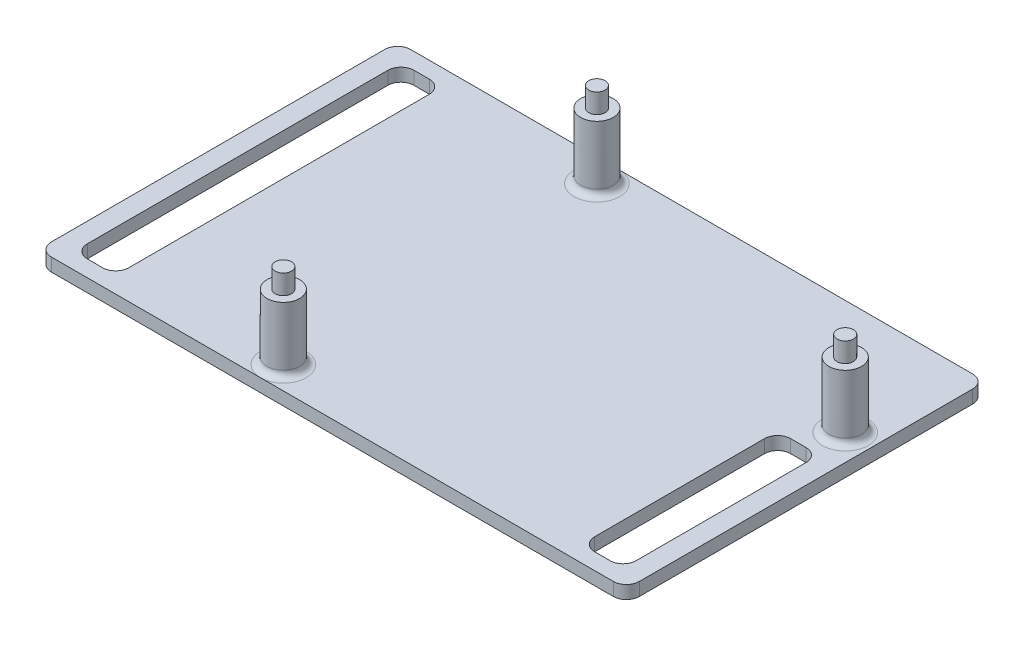
ISO-10303-21;
HEADER;
FILE_DESCRIPTION(('STEP AP214'),'2;1');
FILE_NAME('part.step','',(''),(''),'','','');
FILE_SCHEMA(('AUTOMOTIVE_DESIGN { 1 0 10303 214 1 1 1 1 }'));
ENDSEC;
DATA;
#1=APPLICATION_CONTEXT('core data for automotive mechanical design processes');
#2=APPLICATION_PROTOCOL_DEFINITION('international standard','automotive_design',2000,#1);
#3=PRODUCT_CONTEXT('',#1,'mechanical');
#4=PRODUCT('Part','Part','',(#3));
#5=PRODUCT_RELATED_PRODUCT_CATEGORY('part','',(#4));
#6=PRODUCT_DEFINITION_FORMATION('','',#4);
#7=PRODUCT_DEFINITION_CONTEXT('part definition',#1,'design');
#8=PRODUCT_DEFINITION('design','',#6,#7);
#9=PRODUCT_DEFINITION_SHAPE('','',#8);
#10=(LENGTH_UNIT() NAMED_UNIT(*) SI_UNIT(.MILLI.,.METRE.));
#11=(NAMED_UNIT(*) PLANE_ANGLE_UNIT() SI_UNIT($,.RADIAN.));
#12=(NAMED_UNIT(*) SI_UNIT($,.STERADIAN.) SOLID_ANGLE_UNIT());
#13=UNCERTAINTY_MEASURE_WITH_UNIT(LENGTH_MEASURE(1.E-05),#10,'distance_accuracy_value','');
#14=(GEOMETRIC_REPRESENTATION_CONTEXT(3) GLOBAL_UNCERTAINTY_ASSIGNED_CONTEXT((#13)) GLOBAL_UNIT_ASSIGNED_CONTEXT((#10,
#11,#12)) REPRESENTATION_CONTEXT('',''));
#15=CARTESIAN_POINT('',(0.,0.,0.));
#16=DIRECTION('',(0.,0.,1.));
#17=DIRECTION('',(1.,0.,0.));
#18=AXIS2_PLACEMENT_3D('',#15,#16,#17);
#19=CARTESIAN_POINT('',(0.,2.,0.));
#20=DIRECTION('',(0.,-1.,0.));
#21=DIRECTION('',(0.,0.,-1.));
#22=AXIS2_PLACEMENT_3D('',#19,#20,#21);
#23=PLANE('',#22);
#24=CARTESIAN_POINT('',(86.,2.,-37.5));
#25=DIRECTION('',(0.,-1.,0.));
#26=DIRECTION('',(0.,0.,-1.));
#27=AXIS2_PLACEMENT_3D('',#24,#25,#26);
#28=CIRCLE('',#27,3.50000000000001);
#29=CARTESIAN_POINT('',(86.,2.,-41.));
#30=VERTEX_POINT('',#29);
#31=EDGE_CURVE('E344',#30,#30,#28,.T.);
#32=ORIENTED_EDGE('',*,*,#31,.T.);
#33=EDGE_LOOP('',(#32));
#34=FACE_BOUND('',#33,.T.);
#35=DIRECTION('',(0.,0.,1.));
#36=VECTOR('',#35,1.);
#37=CARTESIAN_POINT('',(80.65,2.,-32.5));
#38=LINE('',#37,#36);
#39=CARTESIAN_POINT('',(80.65,2.,-30.5));
#40=VERTEX_POINT('',#39);
#41=CARTESIAN_POINT('',(80.65,2.,-4.49999999999999));
#42=VERTEX_POINT('',#41);
#43=EDGE_CURVE('E500',#40,#42,#38,.T.);
#44=ORIENTED_EDGE('',*,*,#43,.F.);
#45=CARTESIAN_POINT('',(82.65,2.,-30.5));
#46=DIRECTION('',(0.,-1.,0.));
#47=DIRECTION('',(0.,0.,-1.));
#48=AXIS2_PLACEMENT_3D('',#45,#46,#47);
#49=CIRCLE('',#48,2.);
#50=CARTESIAN_POINT('',(82.65,2.,-32.5));
#51=VERTEX_POINT('',#50);
#52=EDGE_CURVE('E337',#40,#51,#49,.T.);
#53=ORIENTED_EDGE('',*,*,#52,.T.);
#54=DIRECTION('',(-1.,0.,0.));
#55=VECTOR('',#54,1.);
#56=CARTESIAN_POINT('',(80.65,2.,-32.5));
#57=LINE('',#56,#55);
#58=CARTESIAN_POINT('',(85.,2.,-32.5));
#59=VERTEX_POINT('',#58);
#60=EDGE_CURVE('E473',#59,#51,#57,.T.);
#61=ORIENTED_EDGE('',*,*,#60,.F.);
#62=CARTESIAN_POINT('',(85.,2.,-30.5));
#63=DIRECTION('',(0.,-1.,0.));
#64=DIRECTION('',(0.,0.,-1.));
#65=AXIS2_PLACEMENT_3D('',#62,#63,#64);
#66=CIRCLE('',#65,2.);
#67=CARTESIAN_POINT('',(87.,2.,-30.5));
#68=VERTEX_POINT('',#67);
#69=EDGE_CURVE('E333',#59,#68,#66,.T.);
#70=ORIENTED_EDGE('',*,*,#69,.T.);
#71=DIRECTION('',(0.,0.,-1.));
#72=VECTOR('',#71,1.);
#73=CARTESIAN_POINT('',(87.,2.,-32.5));
#74=LINE('',#73,#72);
#75=CARTESIAN_POINT('',(87.,2.,-4.49999999999999));
#76=VERTEX_POINT('',#75);
#77=EDGE_CURVE('E509',#76,#68,#74,.T.);
#78=ORIENTED_EDGE('',*,*,#77,.F.);
#79=CARTESIAN_POINT('',(85.,2.,-4.49999999999999));
#80=DIRECTION('',(0.,-1.,0.));
#81=DIRECTION('',(0.,0.,-1.));
#82=AXIS2_PLACEMENT_3D('',#79,#80,#81);
#83=CIRCLE('',#82,2.);
#84=CARTESIAN_POINT('',(85.,2.,-2.49999999999999));
#85=VERTEX_POINT('',#84);
#86=EDGE_CURVE('E329',#76,#85,#83,.T.);
#87=ORIENTED_EDGE('',*,*,#86,.T.);
#88=DIRECTION('',(1.,0.,0.));
#89=VECTOR('',#88,1.);
#90=CARTESIAN_POINT('',(80.65,2.,-2.49999999999999));
#91=LINE('',#90,#89);
#92=CARTESIAN_POINT('',(82.65,2.,-2.49999999999999));
#93=VERTEX_POINT('',#92);
#94=EDGE_CURVE('E512',#93,#85,#91,.T.);
#95=ORIENTED_EDGE('',*,*,#94,.F.);
#96=CARTESIAN_POINT('',(82.65,2.,-4.49999999999999));
#97=DIRECTION('',(0.,-1.,0.));
#98=DIRECTION('',(0.,0.,-1.));
#99=AXIS2_PLACEMENT_3D('',#96,#97,#98);
#100=CIRCLE('',#99,2.);
#101=EDGE_CURVE('E325',#93,#42,#100,.T.);
#102=ORIENTED_EDGE('',*,*,#101,.T.);
#103=EDGE_LOOP('',(#44,#53,#61,#70,#78,#87,#95,#102));
#104=FACE_BOUND('',#103,.T.);
#105=DIRECTION('',(1.,0.,0.));
#106=VECTOR('',#105,1.);
#107=CARTESIAN_POINT('',(0.,2.,0.));
#108=LINE('',#107,#106);
#109=CARTESIAN_POINT('',(2.,2.,0.));
#110=VERTEX_POINT('',#109);
#111=CARTESIAN_POINT('',(34.,2.,0.));
#112=VERTEX_POINT('',#111);
#113=EDGE_CURVE('E455',#110,#112,#108,.T.);
#114=ORIENTED_EDGE('',*,*,#113,.T.);
#115=CARTESIAN_POINT('',(34.,2.,-3.49999999999999));
#116=DIRECTION('',(0.,-1.,0.));
#117=DIRECTION('',(0.,0.,-1.));
#118=AXIS2_PLACEMENT_3D('',#115,#116,#117);
#119=CIRCLE('',#118,3.49999999999999);
#120=EDGE_CURVE('E52',#112,#112,#119,.T.);
#121=ORIENTED_EDGE('',*,*,#120,.T.);
#122=CARTESIAN_POINT('',(88.,2.,0.));
#123=VERTEX_POINT('',#122);
#124=EDGE_CURVE('E453',#112,#123,#108,.T.);
#125=ORIENTED_EDGE('',*,*,#124,.T.);
#126=CARTESIAN_POINT('',(88.,2.,-2.));
#127=DIRECTION('',(0.,-1.,0.));
#128=DIRECTION('',(0.,0.,-1.));
#129=AXIS2_PLACEMENT_3D('',#126,#127,#128);
#130=CIRCLE('',#129,2.);
#131=CARTESIAN_POINT('',(90.,2.,-2.));
#132=VERTEX_POINT('',#131);
#133=EDGE_CURVE('E296',#123,#132,#130,.F.);
#134=ORIENTED_EDGE('',*,*,#133,.T.);
#135=DIRECTION('',(0.,0.,-1.));
#136=VECTOR('',#135,1.);
#137=CARTESIAN_POINT('',(90.,2.,0.));
#138=LINE('',#137,#136);
#139=CARTESIAN_POINT('',(90.,2.,-53.));
#140=VERTEX_POINT('',#139);
#141=EDGE_CURVE('E463',#132,#140,#138,.T.);
#142=ORIENTED_EDGE('',*,*,#141,.T.);
#143=CARTESIAN_POINT('',(88.,2.,-53.));
#144=DIRECTION('',(0.,-1.,0.));
#145=DIRECTION('',(0.,0.,-1.));
#146=AXIS2_PLACEMENT_3D('',#143,#144,#145);
#147=CIRCLE('',#146,2.);
#148=CARTESIAN_POINT('',(88.,2.,-55.));
#149=VERTEX_POINT('',#148);
#150=EDGE_CURVE('E298',#140,#149,#147,.F.);
#151=ORIENTED_EDGE('',*,*,#150,.T.);
#152=DIRECTION('',(-1.,0.,0.));
#153=VECTOR('',#152,1.);
#154=CARTESIAN_POINT('',(0.,2.,-55.));
#155=LINE('',#154,#153);
#156=CARTESIAN_POINT('',(34.,2.,-55.));
#157=VERTEX_POINT('',#156);
#158=EDGE_CURVE('E466',#149,#157,#155,.T.);
#159=ORIENTED_EDGE('',*,*,#158,.T.);
#160=CARTESIAN_POINT('',(34.,2.,-51.5));
#161=DIRECTION('',(0.,-1.,0.));
#162=DIRECTION('',(0.,0.,-1.));
#163=AXIS2_PLACEMENT_3D('',#160,#161,#162);
#164=CIRCLE('',#163,3.5);
#165=EDGE_CURVE('E57',#157,#157,#164,.T.);
#166=ORIENTED_EDGE('',*,*,#165,.T.);
#167=CARTESIAN_POINT('',(2.,2.,-55.));
#168=VERTEX_POINT('',#167);
#169=EDGE_CURVE('E449',#157,#168,#155,.T.);
#170=ORIENTED_EDGE('',*,*,#169,.T.);
#171=CARTESIAN_POINT('',(2.,2.,-53.));
#172=DIRECTION('',(0.,-1.,0.));
#173=DIRECTION('',(0.,0.,-1.));
#174=AXIS2_PLACEMENT_3D('',#171,#172,#173);
#175=CIRCLE('',#174,2.);
#176=CARTESIAN_POINT('',(0.,2.,-53.));
#177=VERTEX_POINT('',#176);
#178=EDGE_CURVE('E292',#168,#177,#175,.F.);
#179=ORIENTED_EDGE('',*,*,#178,.T.);
#180=DIRECTION('',(0.,0.,1.));
#181=VECTOR('',#180,1.);
#182=CARTESIAN_POINT('',(0.,2.,0.));
#183=LINE('',#182,#181);
#184=CARTESIAN_POINT('',(0.,2.,-2.));
#185=VERTEX_POINT('',#184);
#186=EDGE_CURVE('E446',#177,#185,#183,.T.);
#187=ORIENTED_EDGE('',*,*,#186,.T.);
#188=CARTESIAN_POINT('',(2.,2.,-2.));
#189=DIRECTION('',(0.,-1.,0.));
#190=DIRECTION('',(0.,0.,-1.));
#191=AXIS2_PLACEMENT_3D('',#188,#189,#190);
#192=CIRCLE('',#191,2.);
#193=EDGE_CURVE('E294',#185,#110,#192,.F.);
#194=ORIENTED_EDGE('',*,*,#193,.T.);
#195=EDGE_LOOP('',(#114,#121,#125,#134,#142,#151,#159,#166,#170,#179,#187,#194));
#196=FACE_BOUND('',#195,.T.);
#197=DIRECTION('',(0.,0.,1.));
#198=VECTOR('',#197,1.);
#199=CARTESIAN_POINT('',(3.,2.,-52.5));
#200=LINE('',#199,#198);
#201=CARTESIAN_POINT('',(3.,2.,-50.5));
#202=VERTEX_POINT('',#201);
#203=CARTESIAN_POINT('',(3.,2.,-4.49999999999999));
#204=VERTEX_POINT('',#203);
#205=EDGE_CURVE('E518',#202,#204,#200,.T.);
#206=ORIENTED_EDGE('',*,*,#205,.F.);
#207=CARTESIAN_POINT('',(5.,2.,-50.5));
#208=DIRECTION('',(0.,-1.,0.));
#209=DIRECTION('',(0.,0.,-1.));
#210=AXIS2_PLACEMENT_3D('',#207,#208,#209);
#211=CIRCLE('',#210,2.);
#212=CARTESIAN_POINT('',(5.,2.,-52.5));
#213=VERTEX_POINT('',#212);
#214=EDGE_CURVE('E317',#202,#213,#211,.T.);
#215=ORIENTED_EDGE('',*,*,#214,.T.);
#216=DIRECTION('',(-1.,0.,0.));
#217=VECTOR('',#216,1.);
#218=CARTESIAN_POINT('',(3.,2.,-52.5));
#219=LINE('',#218,#217);
#220=CARTESIAN_POINT('',(7.35,2.,-52.5));
#221=VERTEX_POINT('',#220);
#222=EDGE_CURVE('E506',#221,#213,#219,.T.);
#223=ORIENTED_EDGE('',*,*,#222,.F.);
#224=CARTESIAN_POINT('',(7.35,2.,-50.5));
#225=DIRECTION('',(0.,-1.,0.));
#226=DIRECTION('',(0.,0.,-1.));
#227=AXIS2_PLACEMENT_3D('',#224,#225,#226);
#228=CIRCLE('',#227,2.);
#229=CARTESIAN_POINT('',(9.35,2.,-50.5));
#230=VERTEX_POINT('',#229);
#231=EDGE_CURVE('E313',#221,#230,#228,.T.);
#232=ORIENTED_EDGE('',*,*,#231,.T.);
#233=DIRECTION('',(0.,0.,-1.));
#234=VECTOR('',#233,1.);
#235=CARTESIAN_POINT('',(9.35,2.,-52.5));
#236=LINE('',#235,#234);
#237=CARTESIAN_POINT('',(9.35,2.,-4.49999999999999));
#238=VERTEX_POINT('',#237);
#239=EDGE_CURVE('E527',#238,#230,#236,.T.);
#240=ORIENTED_EDGE('',*,*,#239,.F.);
#241=CARTESIAN_POINT('',(7.35,2.,-4.49999999999999));
#242=DIRECTION('',(0.,-1.,0.));
#243=DIRECTION('',(0.,0.,-1.));
#244=AXIS2_PLACEMENT_3D('',#241,#242,#243);
#245=CIRCLE('',#244,2.);
#246=CARTESIAN_POINT('',(7.35,2.,-2.49999999999999));
#247=VERTEX_POINT('',#246);
#248=EDGE_CURVE('E214',#238,#247,#245,.T.);
#249=ORIENTED_EDGE('',*,*,#248,.T.);
#250=DIRECTION('',(1.,0.,0.));
#251=VECTOR('',#250,1.);
#252=CARTESIAN_POINT('',(3.,2.,-2.49999999999999));
#253=LINE('',#252,#251);
#254=CARTESIAN_POINT('',(5.,2.,-2.49999999999999));
#255=VERTEX_POINT('',#254);
#256=EDGE_CURVE('E529',#255,#247,#253,.T.);
#257=ORIENTED_EDGE('',*,*,#256,.F.);
#258=CARTESIAN_POINT('',(5.,2.,-4.49999999999999));
#259=DIRECTION('',(0.,-1.,0.));
#260=DIRECTION('',(0.,0.,-1.));
#261=AXIS2_PLACEMENT_3D('',#258,#259,#260);
#262=CIRCLE('',#261,2.);
#263=EDGE_CURVE('E215',#255,#204,#262,.T.);
#264=ORIENTED_EDGE('',*,*,#263,.T.);
#265=EDGE_LOOP('',(#206,#215,#223,#232,#240,#249,#257,#264));
#266=FACE_BOUND('',#265,.T.);
#267=ADVANCED_FACE('F39',(#34,#104,#196,#266),#23,.F.);
#268=CARTESIAN_POINT('',(0.,0.,0.));
#269=DIRECTION('',(0.,-1.,0.));
#270=DIRECTION('',(0.,0.,-1.));
#271=AXIS2_PLACEMENT_3D('',#268,#269,#270);
#272=PLANE('',#271);
#273=DIRECTION('',(-1.,0.,0.));
#274=VECTOR('',#273,1.);
#275=CARTESIAN_POINT('',(0.,0.,-55.));
#276=LINE('',#275,#274);
#277=CARTESIAN_POINT('',(88.,0.,-55.));
#278=VERTEX_POINT('',#277);
#279=CARTESIAN_POINT('',(2.,0.,-55.));
#280=VERTEX_POINT('',#279);
#281=EDGE_CURVE('E237',#278,#280,#276,.T.);
#282=ORIENTED_EDGE('',*,*,#281,.F.);
#283=CARTESIAN_POINT('',(88.,0.,-53.));
#284=DIRECTION('',(0.,-1.,0.));
#285=DIRECTION('',(0.,0.,-1.));
#286=AXIS2_PLACEMENT_3D('',#283,#284,#285);
#287=CIRCLE('',#286,2.);
#288=CARTESIAN_POINT('',(90.,0.,-53.));
#289=VERTEX_POINT('',#288);
#290=EDGE_CURVE('E285',#278,#289,#287,.T.);
#291=ORIENTED_EDGE('',*,*,#290,.T.);
#292=DIRECTION('',(0.,0.,-1.));
#293=VECTOR('',#292,1.);
#294=CARTESIAN_POINT('',(90.,0.,0.));
#295=LINE('',#294,#293);
#296=CARTESIAN_POINT('',(90.,0.,-2.));
#297=VERTEX_POINT('',#296);
#298=EDGE_CURVE('E458',#297,#289,#295,.T.);
#299=ORIENTED_EDGE('',*,*,#298,.F.);
#300=CARTESIAN_POINT('',(88.,0.,-2.));
#301=DIRECTION('',(0.,-1.,0.));
#302=DIRECTION('',(0.,0.,-1.));
#303=AXIS2_PLACEMENT_3D('',#300,#301,#302);
#304=CIRCLE('',#303,2.);
#305=CARTESIAN_POINT('',(88.,0.,0.));
#306=VERTEX_POINT('',#305);
#307=EDGE_CURVE('E283',#297,#306,#304,.T.);
#308=ORIENTED_EDGE('',*,*,#307,.T.);
#309=DIRECTION('',(1.,0.,0.));
#310=VECTOR('',#309,1.);
#311=CARTESIAN_POINT('',(0.,0.,0.));
#312=LINE('',#311,#310);
#313=CARTESIAN_POINT('',(2.,0.,0.));
#314=VERTEX_POINT('',#313);
#315=EDGE_CURVE('E472',#314,#306,#312,.T.);
#316=ORIENTED_EDGE('',*,*,#315,.F.);
#317=CARTESIAN_POINT('',(2.,0.,-2.));
#318=DIRECTION('',(0.,-1.,0.));
#319=DIRECTION('',(0.,0.,-1.));
#320=AXIS2_PLACEMENT_3D('',#317,#318,#319);
#321=CIRCLE('',#320,2.);
#322=CARTESIAN_POINT('',(0.,0.,-2.));
#323=VERTEX_POINT('',#322);
#324=EDGE_CURVE('E281',#314,#323,#321,.T.);
#325=ORIENTED_EDGE('',*,*,#324,.T.);
#326=DIRECTION('',(0.,0.,1.));
#327=VECTOR('',#326,1.);
#328=CARTESIAN_POINT('',(0.,0.,0.));
#329=LINE('',#328,#327);
#330=CARTESIAN_POINT('',(0.,0.,-53.));
#331=VERTEX_POINT('',#330);
#332=EDGE_CURVE('E470',#331,#323,#329,.T.);
#333=ORIENTED_EDGE('',*,*,#332,.F.);
#334=CARTESIAN_POINT('',(2.,0.,-53.));
#335=DIRECTION('',(0.,-1.,0.));
#336=DIRECTION('',(0.,0.,-1.));
#337=AXIS2_PLACEMENT_3D('',#334,#335,#336);
#338=CIRCLE('',#337,2.);
#339=EDGE_CURVE('E279',#331,#280,#338,.T.);
#340=ORIENTED_EDGE('',*,*,#339,.T.);
#341=EDGE_LOOP('',(#282,#291,#299,#308,#316,#325,#333,#340));
#342=FACE_BOUND('',#341,.T.);
#343=DIRECTION('',(0.,0.,-1.));
#344=VECTOR('',#343,1.);
#345=CARTESIAN_POINT('',(87.,0.,-32.5));
#346=LINE('',#345,#344);
#347=CARTESIAN_POINT('',(87.,0.,-4.49999999999999));
#348=VERTEX_POINT('',#347);
#349=CARTESIAN_POINT('',(87.,0.,-30.5));
#350=VERTEX_POINT('',#349);
#351=EDGE_CURVE('E493',#348,#350,#346,.T.);
#352=ORIENTED_EDGE('',*,*,#351,.T.);
#353=CARTESIAN_POINT('',(85.,0.,-30.5));
#354=DIRECTION('',(0.,-1.,0.));
#355=DIRECTION('',(0.,0.,-1.));
#356=AXIS2_PLACEMENT_3D('',#353,#354,#355);
#357=CIRCLE('',#356,2.);
#358=CARTESIAN_POINT('',(85.,0.,-32.5));
#359=VERTEX_POINT('',#358);
#360=EDGE_CURVE('E331',#350,#359,#357,.F.);
#361=ORIENTED_EDGE('',*,*,#360,.T.);
#362=DIRECTION('',(-1.,0.,0.));
#363=VECTOR('',#362,1.);
#364=CARTESIAN_POINT('',(80.65,0.,-32.5));
#365=LINE('',#364,#363);
#366=CARTESIAN_POINT('',(82.65,0.,-32.5));
#367=VERTEX_POINT('',#366);
#368=EDGE_CURVE('E460',#359,#367,#365,.T.);
#369=ORIENTED_EDGE('',*,*,#368,.T.);
#370=CARTESIAN_POINT('',(82.65,0.,-30.5));
#371=DIRECTION('',(0.,-1.,0.));
#372=DIRECTION('',(0.,0.,-1.));
#373=AXIS2_PLACEMENT_3D('',#370,#371,#372);
#374=CIRCLE('',#373,2.);
#375=CARTESIAN_POINT('',(80.65,0.,-30.5));
#376=VERTEX_POINT('',#375);
#377=EDGE_CURVE('E335',#367,#376,#374,.F.);
#378=ORIENTED_EDGE('',*,*,#377,.T.);
#379=DIRECTION('',(0.,0.,1.));
#380=VECTOR('',#379,1.);
#381=CARTESIAN_POINT('',(80.65,0.,-32.5));
#382=LINE('',#381,#380);
#383=CARTESIAN_POINT('',(80.65,0.,-4.49999999999999));
#384=VERTEX_POINT('',#383);
#385=EDGE_CURVE('E501',#376,#384,#382,.T.);
#386=ORIENTED_EDGE('',*,*,#385,.T.);
#387=CARTESIAN_POINT('',(82.65,0.,-4.49999999999999));
#388=DIRECTION('',(0.,-1.,0.));
#389=DIRECTION('',(0.,0.,-1.));
#390=AXIS2_PLACEMENT_3D('',#387,#388,#389);
#391=CIRCLE('',#390,2.);
#392=CARTESIAN_POINT('',(82.65,0.,-2.49999999999999));
#393=VERTEX_POINT('',#392);
#394=EDGE_CURVE('E323',#384,#393,#391,.F.);
#395=ORIENTED_EDGE('',*,*,#394,.T.);
#396=DIRECTION('',(1.,0.,0.));
#397=VECTOR('',#396,1.);
#398=CARTESIAN_POINT('',(80.65,0.,-2.49999999999999));
#399=LINE('',#398,#397);
#400=CARTESIAN_POINT('',(85.,0.,-2.49999999999999));
#401=VERTEX_POINT('',#400);
#402=EDGE_CURVE('E499',#393,#401,#399,.T.);
#403=ORIENTED_EDGE('',*,*,#402,.T.);
#404=CARTESIAN_POINT('',(85.,0.,-4.49999999999999));
#405=DIRECTION('',(0.,-1.,0.));
#406=DIRECTION('',(0.,0.,-1.));
#407=AXIS2_PLACEMENT_3D('',#404,#405,#406);
#408=CIRCLE('',#407,2.);
#409=EDGE_CURVE('E327',#401,#348,#408,.F.);
#410=ORIENTED_EDGE('',*,*,#409,.T.);
#411=EDGE_LOOP('',(#352,#361,#369,#378,#386,#395,#403,#410));
#412=FACE_BOUND('',#411,.T.);
#413=DIRECTION('',(0.,0.,-1.));
#414=VECTOR('',#413,1.);
#415=CARTESIAN_POINT('',(9.35,0.,-52.5));
#416=LINE('',#415,#414);
#417=CARTESIAN_POINT('',(9.35,0.,-4.49999999999999));
#418=VERTEX_POINT('',#417);
#419=CARTESIAN_POINT('',(9.35,0.,-50.5));
#420=VERTEX_POINT('',#419);
#421=EDGE_CURVE('E207',#418,#420,#416,.T.);
#422=ORIENTED_EDGE('',*,*,#421,.T.);
#423=CARTESIAN_POINT('',(7.35,0.,-50.5));
#424=DIRECTION('',(0.,-1.,0.));
#425=DIRECTION('',(0.,0.,-1.));
#426=AXIS2_PLACEMENT_3D('',#423,#424,#425);
#427=CIRCLE('',#426,2.);
#428=CARTESIAN_POINT('',(7.35,0.,-52.5));
#429=VERTEX_POINT('',#428);
#430=EDGE_CURVE('E311',#420,#429,#427,.F.);
#431=ORIENTED_EDGE('',*,*,#430,.T.);
#432=DIRECTION('',(-1.,0.,0.));
#433=VECTOR('',#432,1.);
#434=CARTESIAN_POINT('',(3.,0.,-52.5));
#435=LINE('',#434,#433);
#436=CARTESIAN_POINT('',(5.,0.,-52.5));
#437=VERTEX_POINT('',#436);
#438=EDGE_CURVE('E225',#429,#437,#435,.T.);
#439=ORIENTED_EDGE('',*,*,#438,.T.);
#440=CARTESIAN_POINT('',(5.,0.,-50.5));
#441=DIRECTION('',(0.,-1.,0.));
#442=DIRECTION('',(0.,0.,-1.));
#443=AXIS2_PLACEMENT_3D('',#440,#441,#442);
#444=CIRCLE('',#443,2.);
#445=CARTESIAN_POINT('',(3.,0.,-50.5));
#446=VERTEX_POINT('',#445);
#447=EDGE_CURVE('E315',#437,#446,#444,.F.);
#448=ORIENTED_EDGE('',*,*,#447,.T.);
#449=DIRECTION('',(0.,0.,1.));
#450=VECTOR('',#449,1.);
#451=CARTESIAN_POINT('',(3.,0.,-52.5));
#452=LINE('',#451,#450);
#453=CARTESIAN_POINT('',(3.,0.,-4.49999999999999));
#454=VERTEX_POINT('',#453);
#455=EDGE_CURVE('E521',#446,#454,#452,.T.);
#456=ORIENTED_EDGE('',*,*,#455,.T.);
#457=CARTESIAN_POINT('',(5.,0.,-4.49999999999999));
#458=DIRECTION('',(0.,-1.,0.));
#459=DIRECTION('',(0.,0.,-1.));
#460=AXIS2_PLACEMENT_3D('',#457,#458,#459);
#461=CIRCLE('',#460,2.);
#462=CARTESIAN_POINT('',(5.,0.,-2.49999999999999));
#463=VERTEX_POINT('',#462);
#464=EDGE_CURVE('E319',#454,#463,#461,.F.);
#465=ORIENTED_EDGE('',*,*,#464,.T.);
#466=DIRECTION('',(1.,0.,0.));
#467=VECTOR('',#466,1.);
#468=CARTESIAN_POINT('',(3.,0.,-2.49999999999999));
#469=LINE('',#468,#467);
#470=CARTESIAN_POINT('',(7.35,0.,-2.49999999999999));
#471=VERTEX_POINT('',#470);
#472=EDGE_CURVE('E209',#463,#471,#469,.T.);
#473=ORIENTED_EDGE('',*,*,#472,.T.);
#474=CARTESIAN_POINT('',(7.35,0.,-4.49999999999999));
#475=DIRECTION('',(0.,-1.,0.));
#476=DIRECTION('',(0.,0.,-1.));
#477=AXIS2_PLACEMENT_3D('',#474,#475,#476);
#478=CIRCLE('',#477,2.);
#479=EDGE_CURVE('E204',#471,#418,#478,.F.);
#480=ORIENTED_EDGE('',*,*,#479,.T.);
#481=EDGE_LOOP('',(#422,#431,#439,#448,#456,#465,#473,#480));
#482=FACE_BOUND('',#481,.T.);
#483=ADVANCED_FACE('F206',(#342,#412,#482),#272,.T.);
#484=CARTESIAN_POINT('',(0.,2.,0.));
#485=DIRECTION('',(1.,0.,0.));
#486=DIRECTION('',(0.,0.,-1.));
#487=AXIS2_PLACEMENT_3D('',#484,#485,#486);
#488=PLANE('',#487);
#489=ORIENTED_EDGE('',*,*,#332,.T.);
#490=DIRECTION('',(0.,-1.,0.));
#491=VECTOR('',#490,1.);
#492=CARTESIAN_POINT('',(0.,2.,-2.));
#493=LINE('',#492,#491);
#494=EDGE_CURVE('E309',#323,#185,#493,.F.);
#495=ORIENTED_EDGE('',*,*,#494,.T.);
#496=ORIENTED_EDGE('',*,*,#186,.F.);
#497=DIRECTION('',(0.,-1.,0.));
#498=VECTOR('',#497,1.);
#499=CARTESIAN_POINT('',(0.,2.,-53.));
#500=LINE('',#499,#498);
#501=EDGE_CURVE('E306',#177,#331,#500,.T.);
#502=ORIENTED_EDGE('',*,*,#501,.T.);
#503=EDGE_LOOP('',(#489,#495,#496,#502));
#504=FACE_BOUND('',#503,.T.);
#505=ADVANCED_FACE('F370',(#504),#488,.F.);
#506=CARTESIAN_POINT('',(0.,2.,0.));
#507=DIRECTION('',(0.,0.,-1.));
#508=DIRECTION('',(-1.,0.,0.));
#509=AXIS2_PLACEMENT_3D('',#506,#507,#508);
#510=PLANE('',#509);
#511=ORIENTED_EDGE('',*,*,#315,.T.);
#512=DIRECTION('',(0.,-1.,0.));
#513=VECTOR('',#512,1.);
#514=CARTESIAN_POINT('',(88.,2.,0.));
#515=LINE('',#514,#513);
#516=EDGE_CURVE('E303',#306,#123,#515,.F.);
#517=ORIENTED_EDGE('',*,*,#516,.T.);
#518=ORIENTED_EDGE('',*,*,#124,.F.);
#519=ORIENTED_EDGE('',*,*,#113,.F.);
#520=DIRECTION('',(0.,-1.,0.));
#521=VECTOR('',#520,1.);
#522=CARTESIAN_POINT('',(2.,2.,0.));
#523=LINE('',#522,#521);
#524=EDGE_CURVE('E300',#110,#314,#523,.T.);
#525=ORIENTED_EDGE('',*,*,#524,.T.);
#526=EDGE_LOOP('',(#511,#517,#518,#519,#525));
#527=FACE_BOUND('',#526,.T.);
#528=ADVANCED_FACE('F385',(#527),#510,.F.);
#529=CARTESIAN_POINT('',(90.,2.,0.));
#530=DIRECTION('',(-1.,0.,0.));
#531=DIRECTION('',(0.,0.,1.));
#532=AXIS2_PLACEMENT_3D('',#529,#530,#531);
#533=PLANE('',#532);
#534=ORIENTED_EDGE('',*,*,#298,.T.);
#535=DIRECTION('',(0.,-1.,0.));
#536=VECTOR('',#535,1.);
#537=CARTESIAN_POINT('',(90.,2.,-53.));
#538=LINE('',#537,#536);
#539=EDGE_CURVE('E290',#289,#140,#538,.F.);
#540=ORIENTED_EDGE('',*,*,#539,.T.);
#541=ORIENTED_EDGE('',*,*,#141,.F.);
#542=DIRECTION('',(0.,-1.,0.));
#543=VECTOR('',#542,1.);
#544=CARTESIAN_POINT('',(90.,2.,-2.));
#545=LINE('',#544,#543);
#546=EDGE_CURVE('E287',#132,#297,#545,.T.);
#547=ORIENTED_EDGE('',*,*,#546,.T.);
#548=EDGE_LOOP('',(#534,#540,#541,#547));
#549=FACE_BOUND('',#548,.T.);
#550=ADVANCED_FACE('F381',(#549),#533,.F.);
#551=CARTESIAN_POINT('',(0.,2.,-55.));
#552=DIRECTION('',(0.,0.,1.));
#553=DIRECTION('',(1.,0.,0.));
#554=AXIS2_PLACEMENT_3D('',#551,#552,#553);
#555=PLANE('',#554);
#556=ORIENTED_EDGE('',*,*,#158,.F.);
#557=DIRECTION('',(0.,-1.,0.));
#558=VECTOR('',#557,1.);
#559=CARTESIAN_POINT('',(88.,2.,-55.));
#560=LINE('',#559,#558);
#561=EDGE_CURVE('E276',#149,#278,#560,.T.);
#562=ORIENTED_EDGE('',*,*,#561,.T.);
#563=ORIENTED_EDGE('',*,*,#281,.T.);
#564=DIRECTION('',(0.,-1.,0.));
#565=VECTOR('',#564,1.);
#566=CARTESIAN_POINT('',(2.,2.,-55.));
#567=LINE('',#566,#565);
#568=EDGE_CURVE('E273',#280,#168,#567,.F.);
#569=ORIENTED_EDGE('',*,*,#568,.T.);
#570=ORIENTED_EDGE('',*,*,#169,.F.);
#571=EDGE_LOOP('',(#556,#562,#563,#569,#570));
#572=FACE_BOUND('',#571,.T.);
#573=ADVANCED_FACE('F378',(#572),#555,.F.);
#574=CARTESIAN_POINT('',(80.65,2.,-32.5));
#575=DIRECTION('',(1.,0.,0.));
#576=DIRECTION('',(0.,0.,-1.));
#577=AXIS2_PLACEMENT_3D('',#574,#575,#576);
#578=PLANE('',#577);
#579=ORIENTED_EDGE('',*,*,#43,.T.);
#580=DIRECTION('',(0.,-1.,0.));
#581=VECTOR('',#580,1.);
#582=CARTESIAN_POINT('',(80.65,0.,-4.49999999999999));
#583=LINE('',#582,#581);
#584=EDGE_CURVE('E255',#42,#384,#583,.T.);
#585=ORIENTED_EDGE('',*,*,#584,.T.);
#586=ORIENTED_EDGE('',*,*,#385,.F.);
#587=DIRECTION('',(0.,-1.,0.));
#588=VECTOR('',#587,1.);
#589=CARTESIAN_POINT('',(80.65,2.,-30.5));
#590=LINE('',#589,#588);
#591=EDGE_CURVE('E253',#376,#40,#590,.F.);
#592=ORIENTED_EDGE('',*,*,#591,.T.);
#593=EDGE_LOOP('',(#579,#585,#586,#592));
#594=FACE_BOUND('',#593,.T.);
#595=ADVANCED_FACE('F375',(#594),#578,.T.);
#596=CARTESIAN_POINT('',(80.65,2.,-2.49999999999999));
#597=DIRECTION('',(0.,0.,-1.));
#598=DIRECTION('',(-1.,0.,0.));
#599=AXIS2_PLACEMENT_3D('',#596,#597,#598);
#600=PLANE('',#599);
#601=ORIENTED_EDGE('',*,*,#402,.F.);
#602=DIRECTION('',(0.,-1.,0.));
#603=VECTOR('',#602,1.);
#604=CARTESIAN_POINT('',(82.65,2.,-2.49999999999999));
#605=LINE('',#604,#603);
#606=EDGE_CURVE('E261',#393,#93,#605,.F.);
#607=ORIENTED_EDGE('',*,*,#606,.T.);
#608=ORIENTED_EDGE('',*,*,#94,.T.);
#609=DIRECTION('',(0.,-1.,0.));
#610=VECTOR('',#609,1.);
#611=CARTESIAN_POINT('',(85.,0.,-2.49999999999999));
#612=LINE('',#611,#610);
#613=EDGE_CURVE('E258',#85,#401,#612,.T.);
#614=ORIENTED_EDGE('',*,*,#613,.T.);
#615=EDGE_LOOP('',(#601,#607,#608,#614));
#616=FACE_BOUND('',#615,.T.);
#617=ADVANCED_FACE('F612',(#616),#600,.T.);
#618=CARTESIAN_POINT('',(87.,2.,-32.5));
#619=DIRECTION('',(-1.,0.,0.));
#620=DIRECTION('',(0.,0.,1.));
#621=AXIS2_PLACEMENT_3D('',#618,#619,#620);
#622=PLANE('',#621);
#623=ORIENTED_EDGE('',*,*,#351,.F.);
#624=DIRECTION('',(0.,-1.,0.));
#625=VECTOR('',#624,1.);
#626=CARTESIAN_POINT('',(87.,2.,-4.49999999999999));
#627=LINE('',#626,#625);
#628=EDGE_CURVE('E266',#348,#76,#627,.F.);
#629=ORIENTED_EDGE('',*,*,#628,.T.);
#630=ORIENTED_EDGE('',*,*,#77,.T.);
#631=DIRECTION('',(0.,-1.,0.));
#632=VECTOR('',#631,1.);
#633=CARTESIAN_POINT('',(87.,0.,-30.5));
#634=LINE('',#633,#632);
#635=EDGE_CURVE('E263',#68,#350,#634,.T.);
#636=ORIENTED_EDGE('',*,*,#635,.T.);
#637=EDGE_LOOP('',(#623,#629,#630,#636));
#638=FACE_BOUND('',#637,.T.);
#639=ADVANCED_FACE('F609',(#638),#622,.T.);
#640=CARTESIAN_POINT('',(80.65,2.,-32.5));
#641=DIRECTION('',(0.,0.,1.));
#642=DIRECTION('',(1.,0.,0.));
#643=AXIS2_PLACEMENT_3D('',#640,#641,#642);
#644=PLANE('',#643);
#645=ORIENTED_EDGE('',*,*,#368,.F.);
#646=DIRECTION('',(0.,-1.,0.));
#647=VECTOR('',#646,1.);
#648=CARTESIAN_POINT('',(85.,2.,-32.5));
#649=LINE('',#648,#647);
#650=EDGE_CURVE('E271',#359,#59,#649,.F.);
#651=ORIENTED_EDGE('',*,*,#650,.T.);
#652=ORIENTED_EDGE('',*,*,#60,.T.);
#653=DIRECTION('',(0.,-1.,0.));
#654=VECTOR('',#653,1.);
#655=CARTESIAN_POINT('',(82.65,0.,-32.5));
#656=LINE('',#655,#654);
#657=EDGE_CURVE('E268',#51,#367,#656,.T.);
#658=ORIENTED_EDGE('',*,*,#657,.T.);
#659=EDGE_LOOP('',(#645,#651,#652,#658));
#660=FACE_BOUND('',#659,.T.);
#661=ADVANCED_FACE('F605',(#660),#644,.T.);
#662=CARTESIAN_POINT('',(3.,2.,-52.5));
#663=DIRECTION('',(1.,0.,0.));
#664=DIRECTION('',(0.,0.,-1.));
#665=AXIS2_PLACEMENT_3D('',#662,#663,#664);
#666=PLANE('',#665);
#667=ORIENTED_EDGE('',*,*,#455,.F.);
#668=DIRECTION('',(0.,-1.,0.));
#669=VECTOR('',#668,1.);
#670=CARTESIAN_POINT('',(3.,2.,-50.5));
#671=LINE('',#670,#669);
#672=EDGE_CURVE('E247',#446,#202,#671,.F.);
#673=ORIENTED_EDGE('',*,*,#672,.T.);
#674=ORIENTED_EDGE('',*,*,#205,.T.);
#675=DIRECTION('',(0.,-1.,0.));
#676=VECTOR('',#675,1.);
#677=CARTESIAN_POINT('',(3.,0.,-4.49999999999999));
#678=LINE('',#677,#676);
#679=EDGE_CURVE('E244',#204,#454,#678,.T.);
#680=ORIENTED_EDGE('',*,*,#679,.T.);
#681=EDGE_LOOP('',(#667,#673,#674,#680));
#682=FACE_BOUND('',#681,.T.);
#683=ADVANCED_FACE('F601',(#682),#666,.T.);
#684=CARTESIAN_POINT('',(3.,2.,-2.49999999999999));
#685=DIRECTION('',(0.,0.,-1.));
#686=DIRECTION('',(-1.,0.,0.));
#687=AXIS2_PLACEMENT_3D('',#684,#685,#686);
#688=PLANE('',#687);
#689=ORIENTED_EDGE('',*,*,#472,.F.);
#690=DIRECTION('',(0.,-1.,0.));
#691=VECTOR('',#690,1.);
#692=CARTESIAN_POINT('',(5.,2.,-2.49999999999999));
#693=LINE('',#692,#691);
#694=EDGE_CURVE('E251',#463,#255,#693,.F.);
#695=ORIENTED_EDGE('',*,*,#694,.T.);
#696=ORIENTED_EDGE('',*,*,#256,.T.);
#697=DIRECTION('',(0.,-1.,0.));
#698=VECTOR('',#697,1.);
#699=CARTESIAN_POINT('',(7.35,0.,-2.49999999999999));
#700=LINE('',#699,#698);
#701=EDGE_CURVE('E249',#247,#471,#700,.T.);
#702=ORIENTED_EDGE('',*,*,#701,.T.);
#703=EDGE_LOOP('',(#689,#695,#696,#702));
#704=FACE_BOUND('',#703,.T.);
#705=ADVANCED_FACE('F598',(#704),#688,.T.);
#706=CARTESIAN_POINT('',(9.35,2.,-52.5));
#707=DIRECTION('',(-1.,0.,0.));
#708=DIRECTION('',(0.,0.,1.));
#709=AXIS2_PLACEMENT_3D('',#706,#707,#708);
#710=PLANE('',#709);
#711=ORIENTED_EDGE('',*,*,#239,.T.);
#712=DIRECTION('',(0.,-1.,0.));
#713=VECTOR('',#712,1.);
#714=CARTESIAN_POINT('',(9.35,0.,-50.5));
#715=LINE('',#714,#713);
#716=EDGE_CURVE('E224',#230,#420,#715,.T.);
#717=ORIENTED_EDGE('',*,*,#716,.T.);
#718=ORIENTED_EDGE('',*,*,#421,.F.);
#719=DIRECTION('',(0.,-1.,0.));
#720=VECTOR('',#719,1.);
#721=CARTESIAN_POINT('',(9.35,2.,-4.49999999999999));
#722=LINE('',#721,#720);
#723=EDGE_CURVE('E221',#418,#238,#722,.F.);
#724=ORIENTED_EDGE('',*,*,#723,.T.);
#725=EDGE_LOOP('',(#711,#717,#718,#724));
#726=FACE_BOUND('',#725,.T.);
#727=ADVANCED_FACE('F220',(#726),#710,.T.);
#728=CARTESIAN_POINT('',(3.,2.,-52.5));
#729=DIRECTION('',(0.,0.,1.));
#730=DIRECTION('',(1.,0.,0.));
#731=AXIS2_PLACEMENT_3D('',#728,#729,#730);
#732=PLANE('',#731);
#733=ORIENTED_EDGE('',*,*,#438,.F.);
#734=DIRECTION('',(0.,-1.,0.));
#735=VECTOR('',#734,1.);
#736=CARTESIAN_POINT('',(7.35,2.,-52.5));
#737=LINE('',#736,#735);
#738=EDGE_CURVE('E242',#429,#221,#737,.F.);
#739=ORIENTED_EDGE('',*,*,#738,.T.);
#740=ORIENTED_EDGE('',*,*,#222,.T.);
#741=DIRECTION('',(0.,-1.,0.));
#742=VECTOR('',#741,1.);
#743=CARTESIAN_POINT('',(5.,0.,-52.5));
#744=LINE('',#743,#742);
#745=EDGE_CURVE('E231',#213,#437,#744,.T.);
#746=ORIENTED_EDGE('',*,*,#745,.T.);
#747=EDGE_LOOP('',(#733,#739,#740,#746));
#748=FACE_BOUND('',#747,.T.);
#749=ADVANCED_FACE('F588',(#748),#732,.T.);
#750=CARTESIAN_POINT('',(86.,12.,-37.5));
#751=DIRECTION('',(0.,-1.,0.));
#752=DIRECTION('',(0.,0.,-1.));
#753=AXIS2_PLACEMENT_3D('',#750,#751,#752);
#754=CYLINDRICAL_SURFACE('',#753,2.50000000000001);
#755=CARTESIAN_POINT('',(86.,3.,-37.5));
#756=DIRECTION('',(0.,-1.,0.));
#757=DIRECTION('',(0.,0.,-1.));
#758=AXIS2_PLACEMENT_3D('',#755,#756,#757);
#759=CIRCLE('',#758,2.50000000000001);
#760=CARTESIAN_POINT('',(86.,3.,-40.));
#761=VERTEX_POINT('',#760);
#762=EDGE_CURVE('E339',#761,#761,#759,.F.);
#763=ORIENTED_EDGE('',*,*,#762,.T.);
#764=EDGE_LOOP('',(#763));
#765=FACE_BOUND('',#764,.T.);
#766=CARTESIAN_POINT('',(86.,12.,-37.5));
#767=DIRECTION('',(0.,1.,0.));
#768=DIRECTION('',(0.,0.,1.));
#769=AXIS2_PLACEMENT_3D('',#766,#767,#768);
#770=CIRCLE('',#769,2.50000000000001);
#771=CARTESIAN_POINT('',(86.,12.,-35.));
#772=VERTEX_POINT('',#771);
#773=EDGE_CURVE('E534',#772,#772,#770,.T.);
#774=ORIENTED_EDGE('',*,*,#773,.F.);
#775=EDGE_LOOP('',(#774));
#776=FACE_BOUND('',#775,.T.);
#777=ADVANCED_FACE('F585',(#765,#776),#754,.T.);
#778=CARTESIAN_POINT('',(86.,12.,-37.5));
#779=DIRECTION('',(0.,1.,0.));
#780=DIRECTION('',(0.,0.,1.));
#781=AXIS2_PLACEMENT_3D('',#778,#779,#780);
#782=PLANE('',#781);
#783=CARTESIAN_POINT('',(86.,12.,-37.5));
#784=DIRECTION('',(0.,1.,0.));
#785=DIRECTION('',(0.,0.,1.));
#786=AXIS2_PLACEMENT_3D('',#783,#784,#785);
#787=CIRCLE('',#786,1.25);
#788=CARTESIAN_POINT('',(86.,12.,-36.25));
#789=VERTEX_POINT('',#788);
#790=EDGE_CURVE('E229',#789,#789,#787,.T.);
#791=ORIENTED_EDGE('',*,*,#790,.F.);
#792=EDGE_LOOP('',(#791));
#793=FACE_BOUND('',#792,.T.);
#794=ORIENTED_EDGE('',*,*,#773,.T.);
#795=EDGE_LOOP('',(#794));
#796=FACE_BOUND('',#795,.T.);
#797=ADVANCED_FACE('F583',(#793,#796),#782,.T.);
#798=CARTESIAN_POINT('',(34.,12.,-3.49999999999999));
#799=DIRECTION('',(0.,-1.,0.));
#800=DIRECTION('',(0.,0.,-1.));
#801=AXIS2_PLACEMENT_3D('',#798,#799,#800);
#802=CYLINDRICAL_SURFACE('',#801,2.49999999999999);
#803=CARTESIAN_POINT('',(34.,3.,-3.49999999999999));
#804=DIRECTION('',(0.,-1.,0.));
#805=DIRECTION('',(0.,0.,-1.));
#806=AXIS2_PLACEMENT_3D('',#803,#804,#805);
#807=CIRCLE('',#806,2.49999999999999);
#808=CARTESIAN_POINT('',(34.,3.,-5.99999999999998));
#809=VERTEX_POINT('',#808);
#810=EDGE_CURVE('E47',#809,#809,#807,.F.);
#811=ORIENTED_EDGE('',*,*,#810,.T.);
#812=EDGE_LOOP('',(#811));
#813=FACE_BOUND('',#812,.T.);
#814=CARTESIAN_POINT('',(34.,12.,-3.49999999999999));
#815=DIRECTION('',(0.,1.,0.));
#816=DIRECTION('',(0.,0.,1.));
#817=AXIS2_PLACEMENT_3D('',#814,#815,#816);
#818=CIRCLE('',#817,2.49999999999999);
#819=CARTESIAN_POINT('',(34.,12.,-0.999999999999994));
#820=VERTEX_POINT('',#819);
#821=EDGE_CURVE('E537',#820,#820,#818,.T.);
#822=ORIENTED_EDGE('',*,*,#821,.F.);
#823=EDGE_LOOP('',(#822));
#824=FACE_BOUND('',#823,.T.);
#825=ADVANCED_FACE('F349',(#813,#824),#802,.T.);
#826=CARTESIAN_POINT('',(34.,12.,-3.49999999999999));
#827=DIRECTION('',(0.,1.,0.));
#828=DIRECTION('',(0.,0.,1.));
#829=AXIS2_PLACEMENT_3D('',#826,#827,#828);
#830=PLANE('',#829);
#831=CARTESIAN_POINT('',(34.,12.,-3.49999999999999));
#832=DIRECTION('',(0.,1.,0.));
#833=DIRECTION('',(0.,0.,1.));
#834=AXIS2_PLACEMENT_3D('',#831,#832,#833);
#835=CIRCLE('',#834,1.25);
#836=CARTESIAN_POINT('',(34.,12.,-2.24999999999998));
#837=VERTEX_POINT('',#836);
#838=EDGE_CURVE('E234',#837,#837,#835,.T.);
#839=ORIENTED_EDGE('',*,*,#838,.F.);
#840=EDGE_LOOP('',(#839));
#841=FACE_BOUND('',#840,.T.);
#842=ORIENTED_EDGE('',*,*,#821,.T.);
#843=EDGE_LOOP('',(#842));
#844=FACE_BOUND('',#843,.T.);
#845=ADVANCED_FACE('F572',(#841,#844),#830,.T.);
#846=CARTESIAN_POINT('',(34.,12.,-51.5));
#847=DIRECTION('',(0.,-1.,0.));
#848=DIRECTION('',(0.,0.,-1.));
#849=AXIS2_PLACEMENT_3D('',#846,#847,#848);
#850=CYLINDRICAL_SURFACE('',#849,2.5);
#851=CARTESIAN_POINT('',(34.,3.,-51.5));
#852=DIRECTION('',(0.,-1.,0.));
#853=DIRECTION('',(0.,0.,-1.));
#854=AXIS2_PLACEMENT_3D('',#851,#852,#853);
#855=CIRCLE('',#854,2.5);
#856=CARTESIAN_POINT('',(34.,3.,-54.));
#857=VERTEX_POINT('',#856);
#858=EDGE_CURVE('E11',#857,#857,#855,.F.);
#859=ORIENTED_EDGE('',*,*,#858,.T.);
#860=EDGE_LOOP('',(#859));
#861=FACE_BOUND('',#860,.T.);
#862=CARTESIAN_POINT('',(34.,12.,-51.5));
#863=DIRECTION('',(0.,1.,0.));
#864=DIRECTION('',(0.,0.,1.));
#865=AXIS2_PLACEMENT_3D('',#862,#863,#864);
#866=CIRCLE('',#865,2.5);
#867=CARTESIAN_POINT('',(34.,12.,-49.));
#868=VERTEX_POINT('',#867);
#869=EDGE_CURVE('E524',#868,#868,#866,.T.);
#870=ORIENTED_EDGE('',*,*,#869,.F.);
#871=EDGE_LOOP('',(#870));
#872=FACE_BOUND('',#871,.T.);
#873=ADVANCED_FACE('F567',(#861,#872),#850,.T.);
#874=CARTESIAN_POINT('',(34.,12.,-51.5));
#875=DIRECTION('',(0.,1.,0.));
#876=DIRECTION('',(0.,0.,1.));
#877=AXIS2_PLACEMENT_3D('',#874,#875,#876);
#878=PLANE('',#877);
#879=CARTESIAN_POINT('',(34.,12.,-51.5));
#880=DIRECTION('',(0.,1.,0.));
#881=DIRECTION('',(0.,0.,1.));
#882=AXIS2_PLACEMENT_3D('',#879,#880,#881);
#883=CIRCLE('',#882,1.25);
#884=CARTESIAN_POINT('',(34.,12.,-50.25));
#885=VERTEX_POINT('',#884);
#886=EDGE_CURVE('E469',#885,#885,#883,.T.);
#887=ORIENTED_EDGE('',*,*,#886,.F.);
#888=EDGE_LOOP('',(#887));
#889=FACE_BOUND('',#888,.T.);
#890=ORIENTED_EDGE('',*,*,#869,.T.);
#891=EDGE_LOOP('',(#890));
#892=FACE_BOUND('',#891,.T.);
#893=ADVANCED_FACE('F561',(#889,#892),#878,.T.);
#894=CARTESIAN_POINT('',(34.,15.,-51.5));
#895=DIRECTION('',(0.,-1.,0.));
#896=DIRECTION('',(0.,0.,-1.));
#897=AXIS2_PLACEMENT_3D('',#894,#895,#896);
#898=CYLINDRICAL_SURFACE('',#897,1.25);
#899=CARTESIAN_POINT('',(34.,15.,-51.5));
#900=DIRECTION('',(0.,1.,0.));
#901=DIRECTION('',(0.,0.,1.));
#902=AXIS2_PLACEMENT_3D('',#899,#900,#901);
#903=CIRCLE('',#902,1.25);
#904=CARTESIAN_POINT('',(34.,15.,-50.25));
#905=VERTEX_POINT('',#904);
#906=EDGE_CURVE('E538',#905,#905,#903,.T.);
#907=ORIENTED_EDGE('',*,*,#906,.F.);
#908=EDGE_LOOP('',(#907));
#909=FACE_BOUND('',#908,.T.);
#910=ORIENTED_EDGE('',*,*,#886,.T.);
#911=EDGE_LOOP('',(#910));
#912=FACE_BOUND('',#911,.T.);
#913=ADVANCED_FACE('F558',(#909,#912),#898,.T.);
#914=CARTESIAN_POINT('',(34.,15.,-51.5));
#915=DIRECTION('',(0.,1.,0.));
#916=DIRECTION('',(0.,0.,1.));
#917=AXIS2_PLACEMENT_3D('',#914,#915,#916);
#918=PLANE('',#917);
#919=ORIENTED_EDGE('',*,*,#906,.T.);
#920=EDGE_LOOP('',(#919));
#921=FACE_BOUND('',#920,.T.);
#922=ADVANCED_FACE('F556',(#921),#918,.T.);
#923=CARTESIAN_POINT('',(34.,15.,-3.49999999999999));
#924=DIRECTION('',(0.,-1.,0.));
#925=DIRECTION('',(0.,0.,-1.));
#926=AXIS2_PLACEMENT_3D('',#923,#924,#925);
#927=CYLINDRICAL_SURFACE('',#926,1.25);
#928=CARTESIAN_POINT('',(34.,15.,-3.49999999999999));
#929=DIRECTION('',(0.,1.,0.));
#930=DIRECTION('',(0.,0.,1.));
#931=AXIS2_PLACEMENT_3D('',#928,#929,#930);
#932=CIRCLE('',#931,1.25);
#933=CARTESIAN_POINT('',(34.,15.,-2.24999999999998));
#934=VERTEX_POINT('',#933);
#935=EDGE_CURVE('E545',#934,#934,#932,.T.);
#936=ORIENTED_EDGE('',*,*,#935,.F.);
#937=EDGE_LOOP('',(#936));
#938=FACE_BOUND('',#937,.T.);
#939=ORIENTED_EDGE('',*,*,#838,.T.);
#940=EDGE_LOOP('',(#939));
#941=FACE_BOUND('',#940,.T.);
#942=ADVANCED_FACE('F680',(#938,#941),#927,.T.);
#943=CARTESIAN_POINT('',(34.,15.,-3.49999999999999));
#944=DIRECTION('',(0.,1.,0.));
#945=DIRECTION('',(0.,0.,1.));
#946=AXIS2_PLACEMENT_3D('',#943,#944,#945);
#947=PLANE('',#946);
#948=ORIENTED_EDGE('',*,*,#935,.T.);
#949=EDGE_LOOP('',(#948));
#950=FACE_BOUND('',#949,.T.);
#951=ADVANCED_FACE('F671',(#950),#947,.T.);
#952=CARTESIAN_POINT('',(86.,15.,-37.5));
#953=DIRECTION('',(0.,-1.,0.));
#954=DIRECTION('',(0.,0.,-1.));
#955=AXIS2_PLACEMENT_3D('',#952,#953,#954);
#956=CYLINDRICAL_SURFACE('',#955,1.25);
#957=CARTESIAN_POINT('',(86.,15.,-37.5));
#958=DIRECTION('',(0.,1.,0.));
#959=DIRECTION('',(0.,0.,1.));
#960=AXIS2_PLACEMENT_3D('',#957,#958,#959);
#961=CIRCLE('',#960,1.25);
#962=CARTESIAN_POINT('',(86.,15.,-36.25));
#963=VERTEX_POINT('',#962);
#964=EDGE_CURVE('E543',#963,#963,#961,.T.);
#965=ORIENTED_EDGE('',*,*,#964,.F.);
#966=EDGE_LOOP('',(#965));
#967=FACE_BOUND('',#966,.T.);
#968=ORIENTED_EDGE('',*,*,#790,.T.);
#969=EDGE_LOOP('',(#968));
#970=FACE_BOUND('',#969,.T.);
#971=ADVANCED_FACE('F662',(#967,#970),#956,.T.);
#972=CARTESIAN_POINT('',(86.,15.,-37.5));
#973=DIRECTION('',(0.,1.,0.));
#974=DIRECTION('',(0.,0.,1.));
#975=AXIS2_PLACEMENT_3D('',#972,#973,#974);
#976=PLANE('',#975);
#977=ORIENTED_EDGE('',*,*,#964,.T.);
#978=EDGE_LOOP('',(#977));
#979=FACE_BOUND('',#978,.T.);
#980=ADVANCED_FACE('F396',(#979),#976,.T.);
#981=CARTESIAN_POINT('',(7.35,2.,-50.5));
#982=DIRECTION('',(0.,1.,0.));
#983=DIRECTION('',(0.,0.,1.));
#984=AXIS2_PLACEMENT_3D('',#981,#982,#983);
#985=CYLINDRICAL_SURFACE('',#984,2.);
#986=ORIENTED_EDGE('',*,*,#231,.F.);
#987=ORIENTED_EDGE('',*,*,#738,.F.);
#988=ORIENTED_EDGE('',*,*,#430,.F.);
#989=ORIENTED_EDGE('',*,*,#716,.F.);
#990=EDGE_LOOP('',(#986,#987,#988,#989));
#991=FACE_BOUND('',#990,.T.);
#992=ADVANCED_FACE('F392',(#991),#985,.F.);
#993=CARTESIAN_POINT('',(5.,2.,-50.5));
#994=DIRECTION('',(0.,1.,0.));
#995=DIRECTION('',(0.,0.,1.));
#996=AXIS2_PLACEMENT_3D('',#993,#994,#995);
#997=CYLINDRICAL_SURFACE('',#996,2.);
#998=ORIENTED_EDGE('',*,*,#214,.F.);
#999=ORIENTED_EDGE('',*,*,#672,.F.);
#1000=ORIENTED_EDGE('',*,*,#447,.F.);
#1001=ORIENTED_EDGE('',*,*,#745,.F.);
#1002=EDGE_LOOP('',(#998,#999,#1000,#1001));
#1003=FACE_BOUND('',#1002,.T.);
#1004=ADVANCED_FACE('F395',(#1003),#997,.F.);
#1005=CARTESIAN_POINT('',(5.,2.,-4.49999999999999));
#1006=DIRECTION('',(0.,1.,0.));
#1007=DIRECTION('',(0.,0.,1.));
#1008=AXIS2_PLACEMENT_3D('',#1005,#1006,#1007);
#1009=CYLINDRICAL_SURFACE('',#1008,2.);
#1010=ORIENTED_EDGE('',*,*,#263,.F.);
#1011=ORIENTED_EDGE('',*,*,#694,.F.);
#1012=ORIENTED_EDGE('',*,*,#464,.F.);
#1013=ORIENTED_EDGE('',*,*,#679,.F.);
#1014=EDGE_LOOP('',(#1010,#1011,#1012,#1013));
#1015=FACE_BOUND('',#1014,.T.);
#1016=ADVANCED_FACE('F400',(#1015),#1009,.F.);
#1017=CARTESIAN_POINT('',(7.35,2.,-4.49999999999999));
#1018=DIRECTION('',(0.,1.,0.));
#1019=DIRECTION('',(0.,0.,1.));
#1020=AXIS2_PLACEMENT_3D('',#1017,#1018,#1019);
#1021=CYLINDRICAL_SURFACE('',#1020,2.);
#1022=ORIENTED_EDGE('',*,*,#248,.F.);
#1023=ORIENTED_EDGE('',*,*,#723,.F.);
#1024=ORIENTED_EDGE('',*,*,#479,.F.);
#1025=ORIENTED_EDGE('',*,*,#701,.F.);
#1026=EDGE_LOOP('',(#1022,#1023,#1024,#1025));
#1027=FACE_BOUND('',#1026,.T.);
#1028=ADVANCED_FACE('F228',(#1027),#1021,.F.);
#1029=CARTESIAN_POINT('',(82.65,2.,-4.49999999999999));
#1030=DIRECTION('',(0.,1.,0.));
#1031=DIRECTION('',(0.,0.,1.));
#1032=AXIS2_PLACEMENT_3D('',#1029,#1030,#1031);
#1033=CYLINDRICAL_SURFACE('',#1032,2.);
#1034=ORIENTED_EDGE('',*,*,#101,.F.);
#1035=ORIENTED_EDGE('',*,*,#606,.F.);
#1036=ORIENTED_EDGE('',*,*,#394,.F.);
#1037=ORIENTED_EDGE('',*,*,#584,.F.);
#1038=EDGE_LOOP('',(#1034,#1035,#1036,#1037));
#1039=FACE_BOUND('',#1038,.T.);
#1040=ADVANCED_FACE('F407',(#1039),#1033,.F.);
#1041=CARTESIAN_POINT('',(85.,2.,-4.49999999999999));
#1042=DIRECTION('',(0.,1.,0.));
#1043=DIRECTION('',(0.,0.,1.));
#1044=AXIS2_PLACEMENT_3D('',#1041,#1042,#1043);
#1045=CYLINDRICAL_SURFACE('',#1044,2.);
#1046=ORIENTED_EDGE('',*,*,#86,.F.);
#1047=ORIENTED_EDGE('',*,*,#628,.F.);
#1048=ORIENTED_EDGE('',*,*,#409,.F.);
#1049=ORIENTED_EDGE('',*,*,#613,.F.);
#1050=EDGE_LOOP('',(#1046,#1047,#1048,#1049));
#1051=FACE_BOUND('',#1050,.T.);
#1052=ADVANCED_FACE('F410',(#1051),#1045,.F.);
#1053=CARTESIAN_POINT('',(85.,2.,-30.5));
#1054=DIRECTION('',(0.,1.,0.));
#1055=DIRECTION('',(0.,0.,1.));
#1056=AXIS2_PLACEMENT_3D('',#1053,#1054,#1055);
#1057=CYLINDRICAL_SURFACE('',#1056,2.);
#1058=ORIENTED_EDGE('',*,*,#69,.F.);
#1059=ORIENTED_EDGE('',*,*,#650,.F.);
#1060=ORIENTED_EDGE('',*,*,#360,.F.);
#1061=ORIENTED_EDGE('',*,*,#635,.F.);
#1062=EDGE_LOOP('',(#1058,#1059,#1060,#1061));
#1063=FACE_BOUND('',#1062,.T.);
#1064=ADVANCED_FACE('F414',(#1063),#1057,.F.);
#1065=CARTESIAN_POINT('',(82.65,2.,-30.5));
#1066=DIRECTION('',(0.,1.,0.));
#1067=DIRECTION('',(0.,0.,1.));
#1068=AXIS2_PLACEMENT_3D('',#1065,#1066,#1067);
#1069=CYLINDRICAL_SURFACE('',#1068,2.);
#1070=ORIENTED_EDGE('',*,*,#52,.F.);
#1071=ORIENTED_EDGE('',*,*,#591,.F.);
#1072=ORIENTED_EDGE('',*,*,#377,.F.);
#1073=ORIENTED_EDGE('',*,*,#657,.F.);
#1074=EDGE_LOOP('',(#1070,#1071,#1072,#1073));
#1075=FACE_BOUND('',#1074,.T.);
#1076=ADVANCED_FACE('F418',(#1075),#1069,.F.);
#1077=CARTESIAN_POINT('',(88.,2.,-53.));
#1078=DIRECTION('',(0.,-1.,0.));
#1079=DIRECTION('',(0.,0.,-1.));
#1080=AXIS2_PLACEMENT_3D('',#1077,#1078,#1079);
#1081=CYLINDRICAL_SURFACE('',#1080,2.);
#1082=ORIENTED_EDGE('',*,*,#150,.F.);
#1083=ORIENTED_EDGE('',*,*,#539,.F.);
#1084=ORIENTED_EDGE('',*,*,#290,.F.);
#1085=ORIENTED_EDGE('',*,*,#561,.F.);
#1086=EDGE_LOOP('',(#1082,#1083,#1084,#1085));
#1087=FACE_BOUND('',#1086,.T.);
#1088=ADVANCED_FACE('F422',(#1087),#1081,.T.);
#1089=CARTESIAN_POINT('',(88.,2.,-2.));
#1090=DIRECTION('',(0.,-1.,0.));
#1091=DIRECTION('',(0.,0.,-1.));
#1092=AXIS2_PLACEMENT_3D('',#1089,#1090,#1091);
#1093=CYLINDRICAL_SURFACE('',#1092,2.);
#1094=ORIENTED_EDGE('',*,*,#133,.F.);
#1095=ORIENTED_EDGE('',*,*,#516,.F.);
#1096=ORIENTED_EDGE('',*,*,#307,.F.);
#1097=ORIENTED_EDGE('',*,*,#546,.F.);
#1098=EDGE_LOOP('',(#1094,#1095,#1096,#1097));
#1099=FACE_BOUND('',#1098,.T.);
#1100=ADVANCED_FACE('F426',(#1099),#1093,.T.);
#1101=CARTESIAN_POINT('',(2.,2.,-2.));
#1102=DIRECTION('',(0.,-1.,0.));
#1103=DIRECTION('',(0.,0.,-1.));
#1104=AXIS2_PLACEMENT_3D('',#1101,#1102,#1103);
#1105=CYLINDRICAL_SURFACE('',#1104,2.);
#1106=ORIENTED_EDGE('',*,*,#193,.F.);
#1107=ORIENTED_EDGE('',*,*,#494,.F.);
#1108=ORIENTED_EDGE('',*,*,#324,.F.);
#1109=ORIENTED_EDGE('',*,*,#524,.F.);
#1110=EDGE_LOOP('',(#1106,#1107,#1108,#1109));
#1111=FACE_BOUND('',#1110,.T.);
#1112=ADVANCED_FACE('F430',(#1111),#1105,.T.);
#1113=CARTESIAN_POINT('',(2.,2.,-53.));
#1114=DIRECTION('',(0.,-1.,0.));
#1115=DIRECTION('',(0.,0.,-1.));
#1116=AXIS2_PLACEMENT_3D('',#1113,#1114,#1115);
#1117=CYLINDRICAL_SURFACE('',#1116,2.);
#1118=ORIENTED_EDGE('',*,*,#178,.F.);
#1119=ORIENTED_EDGE('',*,*,#568,.F.);
#1120=ORIENTED_EDGE('',*,*,#339,.F.);
#1121=ORIENTED_EDGE('',*,*,#501,.F.);
#1122=EDGE_LOOP('',(#1118,#1119,#1120,#1121));
#1123=FACE_BOUND('',#1122,.T.);
#1124=ADVANCED_FACE('F359',(#1123),#1117,.T.);
#1125=CARTESIAN_POINT('',(86.,3.,-37.5));
#1126=DIRECTION('',(0.,-1.,0.));
#1127=DIRECTION('',(0.,0.,-1.));
#1128=AXIS2_PLACEMENT_3D('',#1125,#1126,#1127);
#1129=TOROIDAL_SURFACE('',#1128,3.50000000000001,1.);
#1130=ORIENTED_EDGE('',*,*,#31,.F.);
#1131=EDGE_LOOP('',(#1130));
#1132=FACE_BOUND('',#1131,.T.);
#1133=ORIENTED_EDGE('',*,*,#762,.F.);
#1134=EDGE_LOOP('',(#1133));
#1135=FACE_BOUND('',#1134,.T.);
#1136=ADVANCED_FACE('F354',(#1132,#1135),#1129,.F.);
#1137=CARTESIAN_POINT('',(34.,3.,-3.49999999999999));
#1138=DIRECTION('',(0.,-1.,0.));
#1139=DIRECTION('',(0.,0.,-1.));
#1140=AXIS2_PLACEMENT_3D('',#1137,#1138,#1139);
#1141=TOROIDAL_SURFACE('',#1140,3.49999999999999,1.);
#1142=ORIENTED_EDGE('',*,*,#120,.F.);
#1143=EDGE_LOOP('',(#1142));
#1144=FACE_BOUND('',#1143,.T.);
#1145=ORIENTED_EDGE('',*,*,#810,.F.);
#1146=EDGE_LOOP('',(#1145));
#1147=FACE_BOUND('',#1146,.T.);
#1148=ADVANCED_FACE('F352',(#1144,#1147),#1141,.F.);
#1149=CARTESIAN_POINT('',(34.,3.,-51.5));
#1150=DIRECTION('',(0.,-1.,0.));
#1151=DIRECTION('',(0.,0.,-1.));
#1152=AXIS2_PLACEMENT_3D('',#1149,#1150,#1151);
#1153=TOROIDAL_SURFACE('',#1152,3.5,1.);
#1154=ORIENTED_EDGE('',*,*,#165,.F.);
#1155=EDGE_LOOP('',(#1154));
#1156=FACE_BOUND('',#1155,.T.);
#1157=ORIENTED_EDGE('',*,*,#858,.F.);
#1158=EDGE_LOOP('',(#1157));
#1159=FACE_BOUND('',#1158,.T.);
#1160=ADVANCED_FACE('F41',(#1156,#1159),#1153,.F.);
#1161=CLOSED_SHELL('',(#267,#483,#505,#528,#550,#573,#595,#617,#639,#661,#683,#705,#727,#749,
#777,#797,#825,#845,#873,#893,#913,#922,#942,#951,#971,#980,#992,#1004,#1016,#1028,#1040,#1052,
#1064,#1076,#1088,#1100,#1112,#1124,#1136,#1148,#1160));
#1162=MANIFOLD_SOLID_BREP('B2',#1161);
#1163=ADVANCED_BREP_SHAPE_REPRESENTATION('',(#18,#1162),#14);
#1164=SHAPE_DEFINITION_REPRESENTATION(#9,#1163);
ENDSEC;
END-ISO-10303-21;
